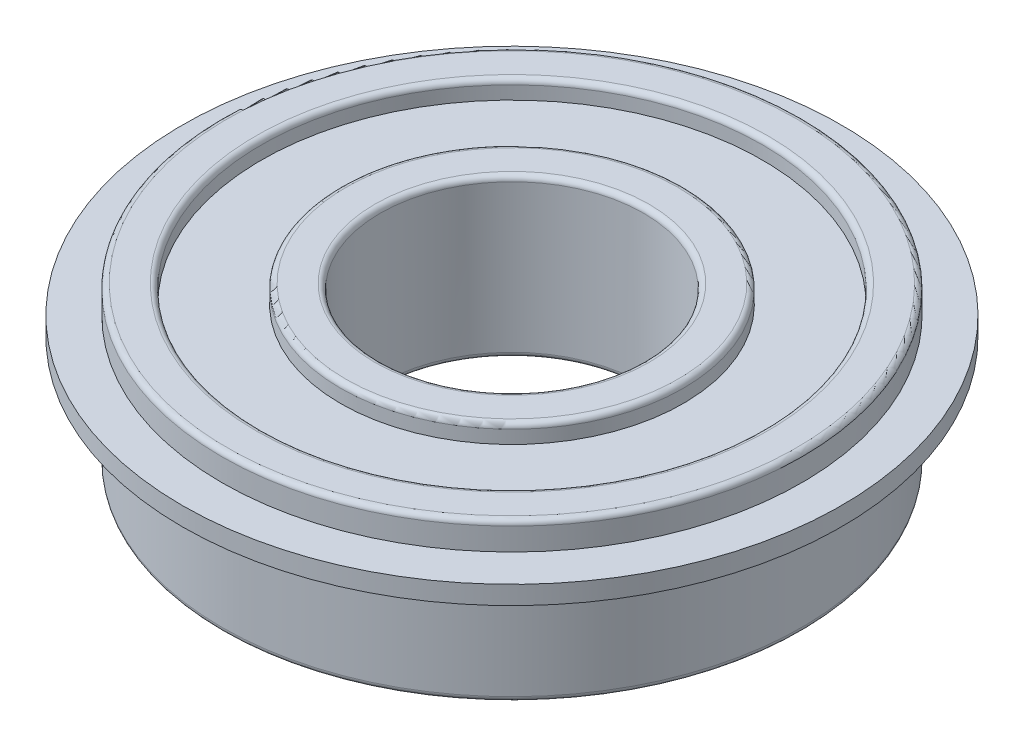
ISO-10303-21;
HEADER;
FILE_DESCRIPTION(('STEP AP214'),'2;1');
FILE_NAME('part.step','',(''),(''),'','','');
FILE_SCHEMA(('AUTOMOTIVE_DESIGN { 1 0 10303 214 1 1 1 1 }'));
ENDSEC;
DATA;
#1=APPLICATION_CONTEXT('core data for automotive mechanical design processes');
#2=APPLICATION_PROTOCOL_DEFINITION('international standard','automotive_design',2000,#1);
#3=PRODUCT_CONTEXT('',#1,'mechanical');
#4=PRODUCT('Part','Part','',(#3));
#5=PRODUCT_RELATED_PRODUCT_CATEGORY('part','',(#4));
#6=PRODUCT_DEFINITION_FORMATION('','',#4);
#7=PRODUCT_DEFINITION_CONTEXT('part definition',#1,'design');
#8=PRODUCT_DEFINITION('design','',#6,#7);
#9=PRODUCT_DEFINITION_SHAPE('','',#8);
#10=(LENGTH_UNIT() NAMED_UNIT(*) SI_UNIT(.MILLI.,.METRE.));
#11=(NAMED_UNIT(*) PLANE_ANGLE_UNIT() SI_UNIT($,.RADIAN.));
#12=(NAMED_UNIT(*) SI_UNIT($,.STERADIAN.) SOLID_ANGLE_UNIT());
#13=UNCERTAINTY_MEASURE_WITH_UNIT(LENGTH_MEASURE(1.E-05),#10,'distance_accuracy_value','');
#14=(GEOMETRIC_REPRESENTATION_CONTEXT(3) GLOBAL_UNCERTAINTY_ASSIGNED_CONTEXT((#13)) GLOBAL_UNIT_ASSIGNED_CONTEXT((#10,
#11,#12)) REPRESENTATION_CONTEXT('',''));
#15=CARTESIAN_POINT('',(0.,0.,0.));
#16=DIRECTION('',(0.,0.,1.));
#17=DIRECTION('',(1.,0.,0.));
#18=AXIS2_PLACEMENT_3D('',#15,#16,#17);
#19=CARTESIAN_POINT('',(0.,4.61129603751149,0.));
#20=DIRECTION('',(0.,1.,0.));
#21=DIRECTION('',(0.,0.,1.));
#22=AXIS2_PLACEMENT_3D('',#19,#20,#21);
#23=CYLINDRICAL_SURFACE('',#22,11.);
#24=CARTESIAN_POINT('',(0.,0.2,0.));
#25=DIRECTION('',(0.,1.,0.));
#26=DIRECTION('',(0.,0.,1.));
#27=AXIS2_PLACEMENT_3D('',#24,#25,#26);
#28=CIRCLE('',#27,11.);
#29=CARTESIAN_POINT('',(0.,0.2,11.));
#30=VERTEX_POINT('',#29);
#31=EDGE_CURVE('E65',#30,#30,#28,.T.);
#32=ORIENTED_EDGE('',*,*,#31,.T.);
#33=EDGE_LOOP('',(#32));
#34=FACE_BOUND('',#33,.T.);
#35=CARTESIAN_POINT('',(0.,4.25,0.));
#36=DIRECTION('',(0.,1.,0.));
#37=DIRECTION('',(0.,0.,1.));
#38=AXIS2_PLACEMENT_3D('',#35,#36,#37);
#39=CIRCLE('',#38,11.);
#40=CARTESIAN_POINT('',(0.,4.25,11.));
#41=VERTEX_POINT('',#40);
#42=EDGE_CURVE('E10',#41,#41,#39,.T.);
#43=ORIENTED_EDGE('',*,*,#42,.F.);
#44=EDGE_LOOP('',(#43));
#45=FACE_BOUND('',#44,.T.);
#46=ADVANCED_FACE('F36',(#34,#45),#23,.T.);
#47=CARTESIAN_POINT('',(6.5,6.,0.));
#48=DIRECTION('',(0.,-1.,0.));
#49=DIRECTION('',(0.,0.,-1.));
#50=AXIS2_PLACEMENT_3D('',#47,#48,#49);
#51=PLANE('',#50);
#52=CARTESIAN_POINT('',(0.,6.,0.));
#53=DIRECTION('',(0.,-1.,0.));
#54=DIRECTION('',(0.,0.,-1.));
#55=AXIS2_PLACEMENT_3D('',#52,#53,#54);
#56=CIRCLE('',#55,6.3);
#57=CARTESIAN_POINT('',(0.,6.,-6.3));
#58=VERTEX_POINT('',#57);
#59=EDGE_CURVE('E59',#58,#58,#56,.F.);
#60=ORIENTED_EDGE('',*,*,#59,.T.);
#61=EDGE_LOOP('',(#60));
#62=FACE_BOUND('',#61,.T.);
#63=CARTESIAN_POINT('',(0.,6.,0.));
#64=DIRECTION('',(0.,-1.,0.));
#65=DIRECTION('',(0.,0.,-1.));
#66=AXIS2_PLACEMENT_3D('',#63,#64,#65);
#67=CIRCLE('',#66,5.2);
#68=CARTESIAN_POINT('',(0.,6.,-5.2));
#69=VERTEX_POINT('',#68);
#70=EDGE_CURVE('E62',#69,#69,#67,.T.);
#71=ORIENTED_EDGE('',*,*,#70,.T.);
#72=EDGE_LOOP('',(#71));
#73=FACE_BOUND('',#72,.T.);
#74=ADVANCED_FACE('F140',(#62,#73),#51,.F.);
#75=CARTESIAN_POINT('',(0.,4.61129603751149,0.));
#76=DIRECTION('',(0.,1.,0.));
#77=DIRECTION('',(0.,0.,1.));
#78=AXIS2_PLACEMENT_3D('',#75,#76,#77);
#79=CYLINDRICAL_SURFACE('',#78,5.);
#80=CARTESIAN_POINT('',(0.,0.2,0.));
#81=DIRECTION('',(0.,1.,0.));
#82=DIRECTION('',(0.,0.,1.));
#83=AXIS2_PLACEMENT_3D('',#80,#81,#82);
#84=CIRCLE('',#83,5.);
#85=CARTESIAN_POINT('',(0.,0.2,5.));
#86=VERTEX_POINT('',#85);
#87=EDGE_CURVE('E83',#86,#86,#84,.F.);
#88=ORIENTED_EDGE('',*,*,#87,.T.);
#89=EDGE_LOOP('',(#88));
#90=FACE_BOUND('',#89,.T.);
#91=CARTESIAN_POINT('',(0.,5.8,0.));
#92=DIRECTION('',(0.,-1.,0.));
#93=DIRECTION('',(0.,0.,-1.));
#94=AXIS2_PLACEMENT_3D('',#91,#92,#93);
#95=CIRCLE('',#94,5.);
#96=CARTESIAN_POINT('',(0.,5.8,-5.));
#97=VERTEX_POINT('',#96);
#98=EDGE_CURVE('E86',#97,#97,#95,.F.);
#99=ORIENTED_EDGE('',*,*,#98,.T.);
#100=EDGE_LOOP('',(#99));
#101=FACE_BOUND('',#100,.T.);
#102=ADVANCED_FACE('F146',(#90,#101),#79,.F.);
#103=CARTESIAN_POINT('',(5.,0.,0.));
#104=DIRECTION('',(0.,1.,0.));
#105=DIRECTION('',(0.,0.,1.));
#106=AXIS2_PLACEMENT_3D('',#103,#104,#105);
#107=PLANE('',#106);
#108=CARTESIAN_POINT('',(0.,0.,0.));
#109=DIRECTION('',(0.,1.,0.));
#110=DIRECTION('',(0.,0.,1.));
#111=AXIS2_PLACEMENT_3D('',#108,#109,#110);
#112=CIRCLE('',#111,5.2);
#113=CARTESIAN_POINT('',(0.,0.,5.2));
#114=VERTEX_POINT('',#113);
#115=EDGE_CURVE('E89',#114,#114,#112,.T.);
#116=ORIENTED_EDGE('',*,*,#115,.T.);
#117=EDGE_LOOP('',(#116));
#118=FACE_BOUND('',#117,.T.);
#119=CARTESIAN_POINT('',(0.,0.,0.));
#120=DIRECTION('',(0.,1.,0.));
#121=DIRECTION('',(0.,0.,1.));
#122=AXIS2_PLACEMENT_3D('',#119,#120,#121);
#123=CIRCLE('',#122,6.3);
#124=CARTESIAN_POINT('',(0.,0.,6.3));
#125=VERTEX_POINT('',#124);
#126=EDGE_CURVE('E92',#125,#125,#123,.F.);
#127=ORIENTED_EDGE('',*,*,#126,.T.);
#128=EDGE_LOOP('',(#127));
#129=FACE_BOUND('',#128,.T.);
#130=ADVANCED_FACE('F177',(#118,#129),#107,.F.);
#131=CARTESIAN_POINT('',(0.,4.61129603751149,0.));
#132=DIRECTION('',(0.,1.,0.));
#133=DIRECTION('',(0.,0.,1.));
#134=AXIS2_PLACEMENT_3D('',#131,#132,#133);
#135=CYLINDRICAL_SURFACE('',#134,6.5);
#136=CARTESIAN_POINT('',(0.,0.2,0.));
#137=DIRECTION('',(0.,1.,0.));
#138=DIRECTION('',(0.,0.,1.));
#139=AXIS2_PLACEMENT_3D('',#136,#137,#138);
#140=CIRCLE('',#139,6.5);
#141=CARTESIAN_POINT('',(0.,0.2,6.5));
#142=VERTEX_POINT('',#141);
#143=EDGE_CURVE('E80',#142,#142,#140,.T.);
#144=ORIENTED_EDGE('',*,*,#143,.T.);
#145=EDGE_LOOP('',(#144));
#146=FACE_BOUND('',#145,.T.);
#147=CARTESIAN_POINT('',(0.,0.7,0.));
#148=DIRECTION('',(0.,1.,0.));
#149=DIRECTION('',(0.,0.,1.));
#150=AXIS2_PLACEMENT_3D('',#147,#148,#149);
#151=CIRCLE('',#150,6.5);
#152=CARTESIAN_POINT('',(0.,0.7,6.5));
#153=VERTEX_POINT('',#152);
#154=EDGE_CURVE('E95',#153,#153,#151,.T.);
#155=ORIENTED_EDGE('',*,*,#154,.F.);
#156=EDGE_LOOP('',(#155));
#157=FACE_BOUND('',#156,.T.);
#158=ADVANCED_FACE('F173',(#146,#157),#135,.T.);
#159=CARTESIAN_POINT('',(6.5,0.7,0.));
#160=DIRECTION('',(0.,1.,0.));
#161=DIRECTION('',(0.,0.,1.));
#162=AXIS2_PLACEMENT_3D('',#159,#160,#161);
#163=PLANE('',#162);
#164=CARTESIAN_POINT('',(0.,0.7,0.));
#165=DIRECTION('',(0.,1.,0.));
#166=DIRECTION('',(0.,0.,1.));
#167=AXIS2_PLACEMENT_3D('',#164,#165,#166);
#168=CIRCLE('',#167,9.5);
#169=CARTESIAN_POINT('',(0.,0.7,9.5));
#170=VERTEX_POINT('',#169);
#171=EDGE_CURVE('E98',#170,#170,#168,.T.);
#172=ORIENTED_EDGE('',*,*,#171,.F.);
#173=EDGE_LOOP('',(#172));
#174=FACE_BOUND('',#173,.T.);
#175=ORIENTED_EDGE('',*,*,#154,.T.);
#176=EDGE_LOOP('',(#175));
#177=FACE_BOUND('',#176,.T.);
#178=ADVANCED_FACE('F166',(#174,#177),#163,.F.);
#179=CARTESIAN_POINT('',(0.,4.61129603751149,0.));
#180=DIRECTION('',(0.,1.,0.));
#181=DIRECTION('',(0.,0.,1.));
#182=AXIS2_PLACEMENT_3D('',#179,#180,#181);
#183=CYLINDRICAL_SURFACE('',#182,9.5);
#184=CARTESIAN_POINT('',(0.,0.2,0.));
#185=DIRECTION('',(0.,1.,0.));
#186=DIRECTION('',(0.,0.,1.));
#187=AXIS2_PLACEMENT_3D('',#184,#185,#186);
#188=CIRCLE('',#187,9.5);
#189=CARTESIAN_POINT('',(0.,0.2,9.5));
#190=VERTEX_POINT('',#189);
#191=EDGE_CURVE('E71',#190,#190,#188,.F.);
#192=ORIENTED_EDGE('',*,*,#191,.T.);
#193=EDGE_LOOP('',(#192));
#194=FACE_BOUND('',#193,.T.);
#195=ORIENTED_EDGE('',*,*,#171,.T.);
#196=EDGE_LOOP('',(#195));
#197=FACE_BOUND('',#196,.T.);
#198=ADVANCED_FACE('F161',(#194,#197),#183,.F.);
#199=CARTESIAN_POINT('',(9.5,0.,0.));
#200=DIRECTION('',(0.,1.,0.));
#201=DIRECTION('',(0.,0.,1.));
#202=AXIS2_PLACEMENT_3D('',#199,#200,#201);
#203=PLANE('',#202);
#204=CARTESIAN_POINT('',(0.,0.,0.));
#205=DIRECTION('',(0.,1.,0.));
#206=DIRECTION('',(0.,0.,1.));
#207=AXIS2_PLACEMENT_3D('',#204,#205,#206);
#208=CIRCLE('',#207,9.7);
#209=CARTESIAN_POINT('',(0.,0.,9.7));
#210=VERTEX_POINT('',#209);
#211=EDGE_CURVE('E74',#210,#210,#208,.T.);
#212=ORIENTED_EDGE('',*,*,#211,.T.);
#213=EDGE_LOOP('',(#212));
#214=FACE_BOUND('',#213,.T.);
#215=CARTESIAN_POINT('',(0.,0.,0.));
#216=DIRECTION('',(0.,1.,0.));
#217=DIRECTION('',(0.,0.,1.));
#218=AXIS2_PLACEMENT_3D('',#215,#216,#217);
#219=CIRCLE('',#218,10.8);
#220=CARTESIAN_POINT('',(0.,0.,10.8));
#221=VERTEX_POINT('',#220);
#222=EDGE_CURVE('E77',#221,#221,#219,.F.);
#223=ORIENTED_EDGE('',*,*,#222,.T.);
#224=EDGE_LOOP('',(#223));
#225=FACE_BOUND('',#224,.T.);
#226=ADVANCED_FACE('F154',(#214,#225),#203,.F.);
#227=CARTESIAN_POINT('',(0.,4.95,0.));
#228=DIRECTION('',(0.,1.,0.));
#229=DIRECTION('',(0.,0.,1.));
#230=AXIS2_PLACEMENT_3D('',#227,#228,#229);
#231=CIRCLE('',#230,11.);
#232=CARTESIAN_POINT('',(0.,4.95,11.));
#233=VERTEX_POINT('',#232);
#234=EDGE_CURVE('E111',#233,#233,#231,.T.);
#235=ORIENTED_EDGE('',*,*,#234,.T.);
#236=EDGE_LOOP('',(#235));
#237=FACE_BOUND('',#236,.T.);
#238=CARTESIAN_POINT('',(0.,5.8,0.));
#239=DIRECTION('',(0.,-1.,0.));
#240=DIRECTION('',(0.,0.,-1.));
#241=AXIS2_PLACEMENT_3D('',#238,#239,#240);
#242=CIRCLE('',#241,11.);
#243=CARTESIAN_POINT('',(0.,5.8,-11.));
#244=VERTEX_POINT('',#243);
#245=EDGE_CURVE('E68',#244,#244,#242,.T.);
#246=ORIENTED_EDGE('',*,*,#245,.T.);
#247=EDGE_LOOP('',(#246));
#248=FACE_BOUND('',#247,.T.);
#249=ADVANCED_FACE('F117',(#237,#248),#23,.T.);
#250=CARTESIAN_POINT('',(11.,6.,0.));
#251=DIRECTION('',(0.,-1.,0.));
#252=DIRECTION('',(0.,0.,-1.));
#253=AXIS2_PLACEMENT_3D('',#250,#251,#252);
#254=PLANE('',#253);
#255=CARTESIAN_POINT('',(0.,6.,0.));
#256=DIRECTION('',(0.,-1.,0.));
#257=DIRECTION('',(0.,0.,-1.));
#258=AXIS2_PLACEMENT_3D('',#255,#256,#257);
#259=CIRCLE('',#258,10.8);
#260=CARTESIAN_POINT('',(0.,6.,-10.8));
#261=VERTEX_POINT('',#260);
#262=EDGE_CURVE('E47',#261,#261,#259,.F.);
#263=ORIENTED_EDGE('',*,*,#262,.T.);
#264=EDGE_LOOP('',(#263));
#265=FACE_BOUND('',#264,.T.);
#266=CARTESIAN_POINT('',(0.,6.,0.));
#267=DIRECTION('',(0.,-1.,0.));
#268=DIRECTION('',(0.,0.,-1.));
#269=AXIS2_PLACEMENT_3D('',#266,#267,#268);
#270=CIRCLE('',#269,9.7);
#271=CARTESIAN_POINT('',(0.,6.,-9.7));
#272=VERTEX_POINT('',#271);
#273=EDGE_CURVE('E51',#272,#272,#270,.T.);
#274=ORIENTED_EDGE('',*,*,#273,.T.);
#275=EDGE_LOOP('',(#274));
#276=FACE_BOUND('',#275,.T.);
#277=ADVANCED_FACE('F153',(#265,#276),#254,.F.);
#278=CARTESIAN_POINT('',(0.,4.61129603751149,0.));
#279=DIRECTION('',(0.,1.,0.));
#280=DIRECTION('',(0.,0.,1.));
#281=AXIS2_PLACEMENT_3D('',#278,#279,#280);
#282=CYLINDRICAL_SURFACE('',#281,9.5);
#283=CARTESIAN_POINT('',(0.,5.8,0.));
#284=DIRECTION('',(0.,-1.,0.));
#285=DIRECTION('',(0.,0.,-1.));
#286=AXIS2_PLACEMENT_3D('',#283,#284,#285);
#287=CIRCLE('',#286,9.5);
#288=CARTESIAN_POINT('',(0.,5.8,-9.5));
#289=VERTEX_POINT('',#288);
#290=EDGE_CURVE('E43',#289,#289,#287,.F.);
#291=ORIENTED_EDGE('',*,*,#290,.T.);
#292=EDGE_LOOP('',(#291));
#293=FACE_BOUND('',#292,.T.);
#294=CARTESIAN_POINT('',(0.,5.3,0.));
#295=DIRECTION('',(0.,1.,0.));
#296=DIRECTION('',(0.,0.,1.));
#297=AXIS2_PLACEMENT_3D('',#294,#295,#296);
#298=CIRCLE('',#297,9.5);
#299=CARTESIAN_POINT('',(0.,5.3,9.5));
#300=VERTEX_POINT('',#299);
#301=EDGE_CURVE('E101',#300,#300,#298,.T.);
#302=ORIENTED_EDGE('',*,*,#301,.F.);
#303=EDGE_LOOP('',(#302));
#304=FACE_BOUND('',#303,.T.);
#305=ADVANCED_FACE('F159',(#293,#304),#282,.F.);
#306=CARTESIAN_POINT('',(9.5,5.3,0.));
#307=DIRECTION('',(0.,-1.,0.));
#308=DIRECTION('',(0.,0.,-1.));
#309=AXIS2_PLACEMENT_3D('',#306,#307,#308);
#310=PLANE('',#309);
#311=CARTESIAN_POINT('',(0.,5.3,0.));
#312=DIRECTION('',(0.,1.,0.));
#313=DIRECTION('',(0.,0.,1.));
#314=AXIS2_PLACEMENT_3D('',#311,#312,#313);
#315=CIRCLE('',#314,6.5);
#316=CARTESIAN_POINT('',(0.,5.3,6.5));
#317=VERTEX_POINT('',#316);
#318=EDGE_CURVE('E104',#317,#317,#315,.T.);
#319=ORIENTED_EDGE('',*,*,#318,.F.);
#320=EDGE_LOOP('',(#319));
#321=FACE_BOUND('',#320,.T.);
#322=ORIENTED_EDGE('',*,*,#301,.T.);
#323=EDGE_LOOP('',(#322));
#324=FACE_BOUND('',#323,.T.);
#325=ADVANCED_FACE('F268',(#321,#324),#310,.F.);
#326=CARTESIAN_POINT('',(0.,4.61129603751149,0.));
#327=DIRECTION('',(0.,1.,0.));
#328=DIRECTION('',(0.,0.,1.));
#329=AXIS2_PLACEMENT_3D('',#326,#327,#328);
#330=CYLINDRICAL_SURFACE('',#329,6.5);
#331=CARTESIAN_POINT('',(0.,5.8,0.));
#332=DIRECTION('',(0.,-1.,0.));
#333=DIRECTION('',(0.,0.,-1.));
#334=AXIS2_PLACEMENT_3D('',#331,#332,#333);
#335=CIRCLE('',#334,6.5);
#336=CARTESIAN_POINT('',(0.,5.8,-6.5));
#337=VERTEX_POINT('',#336);
#338=EDGE_CURVE('E56',#337,#337,#335,.T.);
#339=ORIENTED_EDGE('',*,*,#338,.T.);
#340=EDGE_LOOP('',(#339));
#341=FACE_BOUND('',#340,.T.);
#342=ORIENTED_EDGE('',*,*,#318,.T.);
#343=EDGE_LOOP('',(#342));
#344=FACE_BOUND('',#343,.T.);
#345=ADVANCED_FACE('F189',(#341,#344),#330,.T.);
#346=CARTESIAN_POINT('',(0.,0.2,0.));
#347=DIRECTION('',(0.,1.,0.));
#348=DIRECTION('',(0.,0.,1.));
#349=AXIS2_PLACEMENT_3D('',#346,#347,#348);
#350=TOROIDAL_SURFACE('',#349,5.2,0.2);
#351=ORIENTED_EDGE('',*,*,#87,.F.);
#352=EDGE_LOOP('',(#351));
#353=FACE_BOUND('',#352,.T.);
#354=ORIENTED_EDGE('',*,*,#115,.F.);
#355=EDGE_LOOP('',(#354));
#356=FACE_BOUND('',#355,.T.);
#357=ADVANCED_FACE('F185',(#353,#356),#350,.T.);
#358=CARTESIAN_POINT('',(0.,0.2,0.));
#359=DIRECTION('',(0.,1.,0.));
#360=DIRECTION('',(0.,0.,1.));
#361=AXIS2_PLACEMENT_3D('',#358,#359,#360);
#362=TOROIDAL_SURFACE('',#361,6.3,0.2);
#363=ORIENTED_EDGE('',*,*,#126,.F.);
#364=EDGE_LOOP('',(#363));
#365=FACE_BOUND('',#364,.T.);
#366=ORIENTED_EDGE('',*,*,#143,.F.);
#367=EDGE_LOOP('',(#366));
#368=FACE_BOUND('',#367,.T.);
#369=ADVANCED_FACE('F188',(#365,#368),#362,.T.);
#370=CARTESIAN_POINT('',(0.,0.2,0.));
#371=DIRECTION('',(0.,1.,0.));
#372=DIRECTION('',(0.,0.,1.));
#373=AXIS2_PLACEMENT_3D('',#370,#371,#372);
#374=TOROIDAL_SURFACE('',#373,9.7,0.2);
#375=ORIENTED_EDGE('',*,*,#191,.F.);
#376=EDGE_LOOP('',(#375));
#377=FACE_BOUND('',#376,.T.);
#378=ORIENTED_EDGE('',*,*,#211,.F.);
#379=EDGE_LOOP('',(#378));
#380=FACE_BOUND('',#379,.T.);
#381=ADVANCED_FACE('F193',(#377,#380),#374,.T.);
#382=CARTESIAN_POINT('',(0.,0.2,0.));
#383=DIRECTION('',(0.,1.,0.));
#384=DIRECTION('',(0.,0.,1.));
#385=AXIS2_PLACEMENT_3D('',#382,#383,#384);
#386=TOROIDAL_SURFACE('',#385,10.8,0.2);
#387=ORIENTED_EDGE('',*,*,#222,.F.);
#388=EDGE_LOOP('',(#387));
#389=FACE_BOUND('',#388,.T.);
#390=ORIENTED_EDGE('',*,*,#31,.F.);
#391=EDGE_LOOP('',(#390));
#392=FACE_BOUND('',#391,.T.);
#393=ADVANCED_FACE('F197',(#389,#392),#386,.T.);
#394=CARTESIAN_POINT('',(0.,5.8,0.));
#395=DIRECTION('',(0.,-1.,0.));
#396=DIRECTION('',(0.,0.,-1.));
#397=AXIS2_PLACEMENT_3D('',#394,#395,#396);
#398=TOROIDAL_SURFACE('',#397,6.3,0.2);
#399=ORIENTED_EDGE('',*,*,#338,.F.);
#400=EDGE_LOOP('',(#399));
#401=FACE_BOUND('',#400,.T.);
#402=ORIENTED_EDGE('',*,*,#59,.F.);
#403=EDGE_LOOP('',(#402));
#404=FACE_BOUND('',#403,.T.);
#405=ADVANCED_FACE('F201',(#401,#404),#398,.T.);
#406=CARTESIAN_POINT('',(0.,5.8,0.));
#407=DIRECTION('',(0.,-1.,0.));
#408=DIRECTION('',(0.,0.,-1.));
#409=AXIS2_PLACEMENT_3D('',#406,#407,#408);
#410=TOROIDAL_SURFACE('',#409,5.2,0.2);
#411=ORIENTED_EDGE('',*,*,#70,.F.);
#412=EDGE_LOOP('',(#411));
#413=FACE_BOUND('',#412,.T.);
#414=ORIENTED_EDGE('',*,*,#98,.F.);
#415=EDGE_LOOP('',(#414));
#416=FACE_BOUND('',#415,.T.);
#417=ADVANCED_FACE('F205',(#413,#416),#410,.T.);
#418=CARTESIAN_POINT('',(0.,5.8,0.));
#419=DIRECTION('',(0.,-1.,0.));
#420=DIRECTION('',(0.,0.,-1.));
#421=AXIS2_PLACEMENT_3D('',#418,#419,#420);
#422=TOROIDAL_SURFACE('',#421,10.8,0.2);
#423=ORIENTED_EDGE('',*,*,#245,.F.);
#424=EDGE_LOOP('',(#423));
#425=FACE_BOUND('',#424,.T.);
#426=ORIENTED_EDGE('',*,*,#262,.F.);
#427=EDGE_LOOP('',(#426));
#428=FACE_BOUND('',#427,.T.);
#429=ADVANCED_FACE('F136',(#425,#428),#422,.T.);
#430=CARTESIAN_POINT('',(0.,5.8,0.));
#431=DIRECTION('',(0.,-1.,0.));
#432=DIRECTION('',(0.,0.,-1.));
#433=AXIS2_PLACEMENT_3D('',#430,#431,#432);
#434=TOROIDAL_SURFACE('',#433,9.7,0.2);
#435=ORIENTED_EDGE('',*,*,#273,.F.);
#436=EDGE_LOOP('',(#435));
#437=FACE_BOUND('',#436,.T.);
#438=ORIENTED_EDGE('',*,*,#290,.F.);
#439=EDGE_LOOP('',(#438));
#440=FACE_BOUND('',#439,.T.);
#441=ADVANCED_FACE('F38',(#437,#440),#434,.T.);
#442=CARTESIAN_POINT('',(0.,4.25,0.));
#443=DIRECTION('',(0.,1.,0.));
#444=DIRECTION('',(0.,0.,1.));
#445=AXIS2_PLACEMENT_3D('',#442,#443,#444);
#446=CYLINDRICAL_SURFACE('',#445,12.5);
#447=CARTESIAN_POINT('',(0.,4.25,0.));
#448=DIRECTION('',(0.,1.,0.));
#449=DIRECTION('',(0.,0.,1.));
#450=AXIS2_PLACEMENT_3D('',#447,#448,#449);
#451=CIRCLE('',#450,12.5);
#452=CARTESIAN_POINT('',(0.,4.25,12.5));
#453=VERTEX_POINT('',#452);
#454=EDGE_CURVE('E107',#453,#453,#451,.T.);
#455=ORIENTED_EDGE('',*,*,#454,.T.);
#456=EDGE_LOOP('',(#455));
#457=FACE_BOUND('',#456,.T.);
#458=CARTESIAN_POINT('',(0.,4.95,0.));
#459=DIRECTION('',(0.,1.,0.));
#460=DIRECTION('',(0.,0.,1.));
#461=AXIS2_PLACEMENT_3D('',#458,#459,#460);
#462=CIRCLE('',#461,12.5);
#463=CARTESIAN_POINT('',(0.,4.95,12.5));
#464=VERTEX_POINT('',#463);
#465=EDGE_CURVE('E108',#464,#464,#462,.T.);
#466=ORIENTED_EDGE('',*,*,#465,.F.);
#467=EDGE_LOOP('',(#466));
#468=FACE_BOUND('',#467,.T.);
#469=ADVANCED_FACE('F127',(#457,#468),#446,.T.);
#470=CARTESIAN_POINT('',(0.,4.25,0.));
#471=DIRECTION('',(0.,1.,0.));
#472=DIRECTION('',(0.,0.,1.));
#473=AXIS2_PLACEMENT_3D('',#470,#471,#472);
#474=PLANE('',#473);
#475=ORIENTED_EDGE('',*,*,#42,.T.);
#476=EDGE_LOOP('',(#475));
#477=FACE_BOUND('',#476,.T.);
#478=ORIENTED_EDGE('',*,*,#454,.F.);
#479=EDGE_LOOP('',(#478));
#480=FACE_BOUND('',#479,.T.);
#481=ADVANCED_FACE('F123',(#477,#480),#474,.F.);
#482=CARTESIAN_POINT('',(0.,4.95,0.));
#483=DIRECTION('',(0.,1.,0.));
#484=DIRECTION('',(0.,0.,1.));
#485=AXIS2_PLACEMENT_3D('',#482,#483,#484);
#486=PLANE('',#485);
#487=ORIENTED_EDGE('',*,*,#234,.F.);
#488=EDGE_LOOP('',(#487));
#489=FACE_BOUND('',#488,.T.);
#490=ORIENTED_EDGE('',*,*,#465,.T.);
#491=EDGE_LOOP('',(#490));
#492=FACE_BOUND('',#491,.T.);
#493=ADVANCED_FACE('F120',(#489,#492),#486,.T.);
#494=CLOSED_SHELL('',(#46,#74,#102,#130,#158,#178,#198,#226,#249,#277,#305,#325,#345,#357,#369,
#381,#393,#405,#417,#429,#441,#469,#481,#493));
#495=MANIFOLD_SOLID_BREP('B2',#494);
#496=ADVANCED_BREP_SHAPE_REPRESENTATION('',(#18,#495),#14);
#497=SHAPE_DEFINITION_REPRESENTATION(#9,#496);
ENDSEC;
END-ISO-10303-21;
